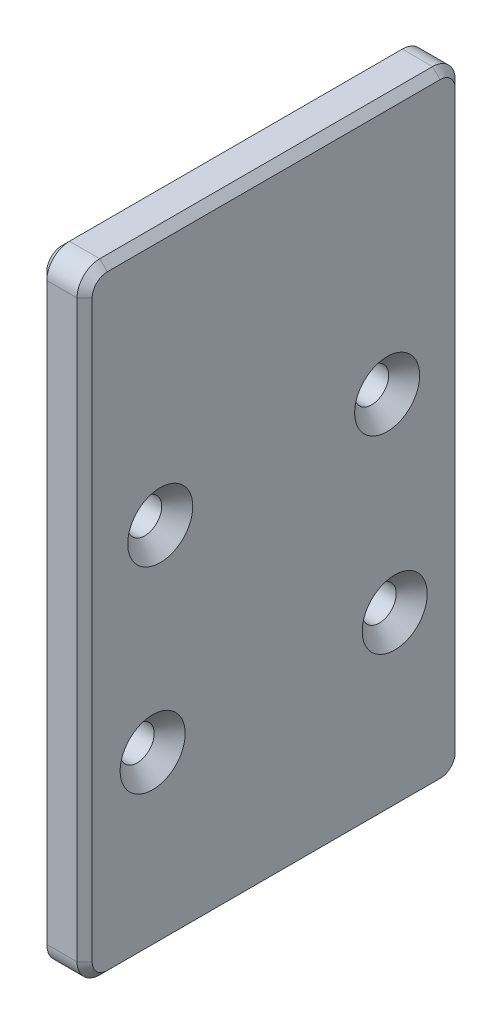
ISO-10303-21;
HEADER;
FILE_DESCRIPTION(('STEP AP214'),'2;1');
FILE_NAME('part.step','',(''),(''),'','','');
FILE_SCHEMA(('AUTOMOTIVE_DESIGN { 1 0 10303 214 1 1 1 1 }'));
ENDSEC;
DATA;
#1=APPLICATION_CONTEXT('core data for automotive mechanical design processes');
#2=APPLICATION_PROTOCOL_DEFINITION('international standard','automotive_design',2000,#1);
#3=PRODUCT_CONTEXT('',#1,'mechanical');
#4=PRODUCT('Part','Part','',(#3));
#5=PRODUCT_RELATED_PRODUCT_CATEGORY('part','',(#4));
#6=PRODUCT_DEFINITION_FORMATION('','',#4);
#7=PRODUCT_DEFINITION_CONTEXT('part definition',#1,'design');
#8=PRODUCT_DEFINITION('design','',#6,#7);
#9=PRODUCT_DEFINITION_SHAPE('','',#8);
#10=(LENGTH_UNIT() NAMED_UNIT(*) SI_UNIT(.MILLI.,.METRE.));
#11=(NAMED_UNIT(*) PLANE_ANGLE_UNIT() SI_UNIT($,.RADIAN.));
#12=(NAMED_UNIT(*) SI_UNIT($,.STERADIAN.) SOLID_ANGLE_UNIT());
#13=UNCERTAINTY_MEASURE_WITH_UNIT(LENGTH_MEASURE(1.E-05),#10,'distance_accuracy_value','');
#14=(GEOMETRIC_REPRESENTATION_CONTEXT(3) GLOBAL_UNCERTAINTY_ASSIGNED_CONTEXT((#13)) GLOBAL_UNIT_ASSIGNED_CONTEXT((#10,
#11,#12)) REPRESENTATION_CONTEXT('',''));
#15=CARTESIAN_POINT('',(0.,0.,0.));
#16=DIRECTION('',(0.,0.,1.));
#17=DIRECTION('',(1.,0.,0.));
#18=AXIS2_PLACEMENT_3D('',#15,#16,#17);
#19=CARTESIAN_POINT('',(6.,-41.,-25.));
#20=DIRECTION('',(0.,0.,1.));
#21=DIRECTION('',(1.,0.,0.));
#22=AXIS2_PLACEMENT_3D('',#19,#20,#21);
#23=PLANE('',#22);
#24=DIRECTION('',(-1.,0.,0.));
#25=VECTOR('',#24,1.);
#26=CARTESIAN_POINT('',(6.,-38.,-25.));
#27=LINE('',#26,#25);
#28=CARTESIAN_POINT('',(5.,-38.,-25.));
#29=VERTEX_POINT('',#28);
#30=CARTESIAN_POINT('',(1.,-38.,-25.));
#31=VERTEX_POINT('',#30);
#32=EDGE_CURVE('E288',#29,#31,#27,.T.);
#33=ORIENTED_EDGE('',*,*,#32,.T.);
#34=DIRECTION('',(0.,1.,0.));
#35=VECTOR('',#34,1.);
#36=CARTESIAN_POINT('',(1.,38.,-25.));
#37=LINE('',#36,#35);
#38=CARTESIAN_POINT('',(1.,38.,-25.));
#39=VERTEX_POINT('',#38);
#40=EDGE_CURVE('E193',#31,#39,#37,.T.);
#41=ORIENTED_EDGE('',*,*,#40,.T.);
#42=DIRECTION('',(-1.,0.,0.));
#43=VECTOR('',#42,1.);
#44=CARTESIAN_POINT('',(6.,38.,-25.));
#45=LINE('',#44,#43);
#46=CARTESIAN_POINT('',(5.,38.,-25.));
#47=VERTEX_POINT('',#46);
#48=EDGE_CURVE('E305',#39,#47,#45,.F.);
#49=ORIENTED_EDGE('',*,*,#48,.T.);
#50=DIRECTION('',(0.,-1.,0.));
#51=VECTOR('',#50,1.);
#52=CARTESIAN_POINT('',(5.,-41.,-25.));
#53=LINE('',#52,#51);
#54=EDGE_CURVE('E191',#47,#29,#53,.T.);
#55=ORIENTED_EDGE('',*,*,#54,.T.);
#56=EDGE_LOOP('',(#33,#41,#49,#55));
#57=FACE_BOUND('',#56,.T.);
#58=ADVANCED_FACE('F43',(#57),#23,.F.);
#59=CARTESIAN_POINT('',(6.,41.,25.));
#60=DIRECTION('',(0.,-1.,0.));
#61=DIRECTION('',(0.,0.,-1.));
#62=AXIS2_PLACEMENT_3D('',#59,#60,#61);
#63=PLANE('',#62);
#64=DIRECTION('',(-1.,0.,0.));
#65=VECTOR('',#64,1.);
#66=CARTESIAN_POINT('',(6.,41.,-22.));
#67=LINE('',#66,#65);
#68=CARTESIAN_POINT('',(5.,41.,-22.));
#69=VERTEX_POINT('',#68);
#70=CARTESIAN_POINT('',(1.,41.,-22.));
#71=VERTEX_POINT('',#70);
#72=EDGE_CURVE('E309',#69,#71,#67,.T.);
#73=ORIENTED_EDGE('',*,*,#72,.T.);
#74=DIRECTION('',(0.,0.,1.));
#75=VECTOR('',#74,1.);
#76=CARTESIAN_POINT('',(1.,41.,22.));
#77=LINE('',#76,#75);
#78=CARTESIAN_POINT('',(1.,41.,22.));
#79=VERTEX_POINT('',#78);
#80=EDGE_CURVE('E201',#71,#79,#77,.T.);
#81=ORIENTED_EDGE('',*,*,#80,.T.);
#82=DIRECTION('',(-1.,0.,0.));
#83=VECTOR('',#82,1.);
#84=CARTESIAN_POINT('',(6.,41.,22.));
#85=LINE('',#84,#83);
#86=CARTESIAN_POINT('',(5.,41.,22.));
#87=VERTEX_POINT('',#86);
#88=EDGE_CURVE('E177',#79,#87,#85,.F.);
#89=ORIENTED_EDGE('',*,*,#88,.T.);
#90=DIRECTION('',(0.,0.,-1.));
#91=VECTOR('',#90,1.);
#92=CARTESIAN_POINT('',(5.,41.,25.));
#93=LINE('',#92,#91);
#94=EDGE_CURVE('E199',#87,#69,#93,.T.);
#95=ORIENTED_EDGE('',*,*,#94,.T.);
#96=EDGE_LOOP('',(#73,#81,#89,#95));
#97=FACE_BOUND('',#96,.T.);
#98=ADVANCED_FACE('F375',(#97),#63,.F.);
#99=CARTESIAN_POINT('',(6.,-41.,25.));
#100=DIRECTION('',(0.,0.,-1.));
#101=DIRECTION('',(-1.,0.,0.));
#102=AXIS2_PLACEMENT_3D('',#99,#100,#101);
#103=PLANE('',#102);
#104=DIRECTION('',(-1.,0.,0.));
#105=VECTOR('',#104,1.);
#106=CARTESIAN_POINT('',(6.,38.,25.));
#107=LINE('',#106,#105);
#108=CARTESIAN_POINT('',(5.,38.,25.));
#109=VERTEX_POINT('',#108);
#110=CARTESIAN_POINT('',(1.,38.,25.));
#111=VERTEX_POINT('',#110);
#112=EDGE_CURVE('E295',#109,#111,#107,.T.);
#113=ORIENTED_EDGE('',*,*,#112,.T.);
#114=DIRECTION('',(0.,-1.,0.));
#115=VECTOR('',#114,1.);
#116=CARTESIAN_POINT('',(1.,-38.,25.));
#117=LINE('',#116,#115);
#118=CARTESIAN_POINT('',(1.,-38.,25.));
#119=VERTEX_POINT('',#118);
#120=EDGE_CURVE('E210',#111,#119,#117,.T.);
#121=ORIENTED_EDGE('',*,*,#120,.T.);
#122=DIRECTION('',(-1.,0.,0.));
#123=VECTOR('',#122,1.);
#124=CARTESIAN_POINT('',(6.,-38.,25.));
#125=LINE('',#124,#123);
#126=CARTESIAN_POINT('',(5.,-38.,25.));
#127=VERTEX_POINT('',#126);
#128=EDGE_CURVE('E302',#119,#127,#125,.F.);
#129=ORIENTED_EDGE('',*,*,#128,.T.);
#130=DIRECTION('',(0.,1.,0.));
#131=VECTOR('',#130,1.);
#132=CARTESIAN_POINT('',(5.,-41.,25.));
#133=LINE('',#132,#131);
#134=EDGE_CURVE('E208',#127,#109,#133,.T.);
#135=ORIENTED_EDGE('',*,*,#134,.T.);
#136=EDGE_LOOP('',(#113,#121,#129,#135));
#137=FACE_BOUND('',#136,.T.);
#138=ADVANCED_FACE('F359',(#137),#103,.F.);
#139=CARTESIAN_POINT('',(6.,-41.,25.));
#140=DIRECTION('',(0.,1.,0.));
#141=DIRECTION('',(0.,0.,1.));
#142=AXIS2_PLACEMENT_3D('',#139,#140,#141);
#143=PLANE('',#142);
#144=DIRECTION('',(-1.,0.,0.));
#145=VECTOR('',#144,1.);
#146=CARTESIAN_POINT('',(6.,-41.,22.));
#147=LINE('',#146,#145);
#148=CARTESIAN_POINT('',(5.,-41.,22.));
#149=VERTEX_POINT('',#148);
#150=CARTESIAN_POINT('',(1.,-41.,22.));
#151=VERTEX_POINT('',#150);
#152=EDGE_CURVE('E293',#149,#151,#147,.T.);
#153=ORIENTED_EDGE('',*,*,#152,.T.);
#154=DIRECTION('',(0.,0.,-1.));
#155=VECTOR('',#154,1.);
#156=CARTESIAN_POINT('',(1.,-41.,-22.));
#157=LINE('',#156,#155);
#158=CARTESIAN_POINT('',(1.,-41.,-22.));
#159=VERTEX_POINT('',#158);
#160=EDGE_CURVE('E218',#151,#159,#157,.T.);
#161=ORIENTED_EDGE('',*,*,#160,.T.);
#162=DIRECTION('',(-1.,0.,0.));
#163=VECTOR('',#162,1.);
#164=CARTESIAN_POINT('',(6.,-41.,-22.));
#165=LINE('',#164,#163);
#166=CARTESIAN_POINT('',(5.,-41.,-22.));
#167=VERTEX_POINT('',#166);
#168=EDGE_CURVE('E249',#159,#167,#165,.F.);
#169=ORIENTED_EDGE('',*,*,#168,.T.);
#170=DIRECTION('',(0.,0.,1.));
#171=VECTOR('',#170,1.);
#172=CARTESIAN_POINT('',(5.,-41.,25.));
#173=LINE('',#172,#171);
#174=EDGE_CURVE('E216',#167,#149,#173,.T.);
#175=ORIENTED_EDGE('',*,*,#174,.T.);
#176=EDGE_LOOP('',(#153,#161,#169,#175));
#177=FACE_BOUND('',#176,.T.);
#178=ADVANCED_FACE('F291',(#177),#143,.F.);
#179=CARTESIAN_POINT('',(6.,0.,0.));
#180=DIRECTION('',(-1.,0.,0.));
#181=DIRECTION('',(0.,0.,1.));
#182=AXIS2_PLACEMENT_3D('',#179,#180,#181);
#183=PLANE('',#182);
#184=CARTESIAN_POINT('',(6.,7.50000000000023,-14.9999999999996));
#185=DIRECTION('',(1.,0.,0.));
#186=DIRECTION('',(0.,0.,-1.));
#187=AXIS2_PLACEMENT_3D('',#184,#185,#186);
#188=CIRCLE('',#187,4.3);
#189=CARTESIAN_POINT('',(6.,7.50000000000023,-19.2999999999995));
#190=VERTEX_POINT('',#189);
#191=EDGE_CURVE('E722',#190,#190,#188,.T.);
#192=ORIENTED_EDGE('',*,*,#191,.F.);
#193=EDGE_LOOP('',(#192));
#194=FACE_BOUND('',#193,.T.);
#195=CARTESIAN_POINT('',(6.,7.50000000000021,15.0000000000004));
#196=DIRECTION('',(1.,0.,0.));
#197=DIRECTION('',(0.,0.,-1.));
#198=AXIS2_PLACEMENT_3D('',#195,#196,#197);
#199=CIRCLE('',#198,4.3);
#200=CARTESIAN_POINT('',(6.,7.50000000000021,10.7000000000004));
#201=VERTEX_POINT('',#200);
#202=EDGE_CURVE('E729',#201,#201,#199,.T.);
#203=ORIENTED_EDGE('',*,*,#202,.F.);
#204=EDGE_LOOP('',(#203));
#205=FACE_BOUND('',#204,.T.);
#206=CARTESIAN_POINT('',(6.,-17.9999999999998,-15.9999999999996));
#207=DIRECTION('',(1.,0.,0.));
#208=DIRECTION('',(0.,0.,-1.));
#209=AXIS2_PLACEMENT_3D('',#206,#207,#208);
#210=CIRCLE('',#209,4.3);
#211=CARTESIAN_POINT('',(6.,-17.9999999999998,-20.2999999999996));
#212=VERTEX_POINT('',#211);
#213=EDGE_CURVE('E738',#212,#212,#210,.T.);
#214=ORIENTED_EDGE('',*,*,#213,.F.);
#215=EDGE_LOOP('',(#214));
#216=FACE_BOUND('',#215,.T.);
#217=CARTESIAN_POINT('',(6.,-17.9999999999998,16.0000000000004));
#218=DIRECTION('',(1.,0.,0.));
#219=DIRECTION('',(0.,0.,-1.));
#220=AXIS2_PLACEMENT_3D('',#217,#218,#219);
#221=CIRCLE('',#220,4.3);
#222=CARTESIAN_POINT('',(6.,-17.9999999999998,11.7000000000004));
#223=VERTEX_POINT('',#222);
#224=EDGE_CURVE('E747',#223,#223,#221,.T.);
#225=ORIENTED_EDGE('',*,*,#224,.F.);
#226=EDGE_LOOP('',(#225));
#227=FACE_BOUND('',#226,.T.);
#228=DIRECTION('',(0.,0.,1.));
#229=VECTOR('',#228,1.);
#230=CARTESIAN_POINT('',(6.,40.,0.));
#231=LINE('',#230,#229);
#232=CARTESIAN_POINT('',(6.,40.,-22.));
#233=VERTEX_POINT('',#232);
#234=CARTESIAN_POINT('',(6.,40.,22.));
#235=VERTEX_POINT('',#234);
#236=EDGE_CURVE('E53',#233,#235,#231,.T.);
#237=ORIENTED_EDGE('',*,*,#236,.T.);
#238=CARTESIAN_POINT('',(6.,38.,22.));
#239=DIRECTION('',(-1.,0.,0.));
#240=DIRECTION('',(0.,0.,1.));
#241=AXIS2_PLACEMENT_3D('',#238,#239,#240);
#242=CIRCLE('',#241,2.);
#243=CARTESIAN_POINT('',(6.,38.,24.));
#244=VERTEX_POINT('',#243);
#245=EDGE_CURVE('E11',#235,#244,#242,.F.);
#246=ORIENTED_EDGE('',*,*,#245,.T.);
#247=DIRECTION('',(0.,-1.,0.));
#248=VECTOR('',#247,1.);
#249=CARTESIAN_POINT('',(6.,0.,24.));
#250=LINE('',#249,#248);
#251=CARTESIAN_POINT('',(6.,-38.,24.));
#252=VERTEX_POINT('',#251);
#253=EDGE_CURVE('E220',#244,#252,#250,.T.);
#254=ORIENTED_EDGE('',*,*,#253,.T.);
#255=CARTESIAN_POINT('',(6.,-38.,22.));
#256=DIRECTION('',(-1.,0.,0.));
#257=DIRECTION('',(0.,0.,1.));
#258=AXIS2_PLACEMENT_3D('',#255,#256,#257);
#259=CIRCLE('',#258,2.);
#260=CARTESIAN_POINT('',(6.,-40.,22.));
#261=VERTEX_POINT('',#260);
#262=EDGE_CURVE('E222',#252,#261,#259,.F.);
#263=ORIENTED_EDGE('',*,*,#262,.T.);
#264=DIRECTION('',(0.,0.,-1.));
#265=VECTOR('',#264,1.);
#266=CARTESIAN_POINT('',(6.,-40.,0.));
#267=LINE('',#266,#265);
#268=CARTESIAN_POINT('',(6.,-40.,-22.));
#269=VERTEX_POINT('',#268);
#270=EDGE_CURVE('E224',#261,#269,#267,.T.);
#271=ORIENTED_EDGE('',*,*,#270,.T.);
#272=CARTESIAN_POINT('',(6.,-38.,-22.));
#273=DIRECTION('',(-1.,0.,0.));
#274=DIRECTION('',(0.,0.,1.));
#275=AXIS2_PLACEMENT_3D('',#272,#273,#274);
#276=CIRCLE('',#275,2.);
#277=CARTESIAN_POINT('',(6.,-38.,-24.));
#278=VERTEX_POINT('',#277);
#279=EDGE_CURVE('E226',#269,#278,#276,.F.);
#280=ORIENTED_EDGE('',*,*,#279,.T.);
#281=DIRECTION('',(0.,1.,0.));
#282=VECTOR('',#281,1.);
#283=CARTESIAN_POINT('',(6.,0.,-24.));
#284=LINE('',#283,#282);
#285=CARTESIAN_POINT('',(6.,38.,-24.));
#286=VERTEX_POINT('',#285);
#287=EDGE_CURVE('E228',#278,#286,#284,.T.);
#288=ORIENTED_EDGE('',*,*,#287,.T.);
#289=CARTESIAN_POINT('',(6.,38.,-22.));
#290=DIRECTION('',(-1.,0.,0.));
#291=DIRECTION('',(0.,0.,1.));
#292=AXIS2_PLACEMENT_3D('',#289,#290,#291);
#293=CIRCLE('',#292,2.);
#294=EDGE_CURVE('E64',#286,#233,#293,.F.);
#295=ORIENTED_EDGE('',*,*,#294,.T.);
#296=EDGE_LOOP('',(#237,#246,#254,#263,#271,#280,#288,#295));
#297=FACE_BOUND('',#296,.T.);
#298=ADVANCED_FACE('F347',(#194,#205,#216,#227,#297),#183,.F.);
#299=CARTESIAN_POINT('',(0.,0.,0.));
#300=DIRECTION('',(-1.,0.,0.));
#301=DIRECTION('',(0.,0.,1.));
#302=AXIS2_PLACEMENT_3D('',#299,#300,#301);
#303=PLANE('',#302);
#304=CARTESIAN_POINT('',(0.,7.50000000000023,-14.9999999999996));
#305=DIRECTION('',(1.,0.,0.));
#306=DIRECTION('',(0.,0.,-1.));
#307=AXIS2_PLACEMENT_3D('',#304,#305,#306);
#308=CIRCLE('',#307,2.25);
#309=CARTESIAN_POINT('',(0.,7.50000000000023,-17.2499999999995));
#310=VERTEX_POINT('',#309);
#311=EDGE_CURVE('E724',#310,#310,#308,.T.);
#312=ORIENTED_EDGE('',*,*,#311,.T.);
#313=EDGE_LOOP('',(#312));
#314=FACE_BOUND('',#313,.T.);
#315=CARTESIAN_POINT('',(0.,7.50000000000021,15.0000000000004));
#316=DIRECTION('',(1.,0.,0.));
#317=DIRECTION('',(0.,0.,-1.));
#318=AXIS2_PLACEMENT_3D('',#315,#316,#317);
#319=CIRCLE('',#318,2.25);
#320=CARTESIAN_POINT('',(0.,7.50000000000021,12.7500000000005));
#321=VERTEX_POINT('',#320);
#322=EDGE_CURVE('E735',#321,#321,#319,.T.);
#323=ORIENTED_EDGE('',*,*,#322,.T.);
#324=EDGE_LOOP('',(#323));
#325=FACE_BOUND('',#324,.T.);
#326=CARTESIAN_POINT('',(0.,-17.9999999999998,-15.9999999999996));
#327=DIRECTION('',(1.,0.,0.));
#328=DIRECTION('',(0.,0.,-1.));
#329=AXIS2_PLACEMENT_3D('',#326,#327,#328);
#330=CIRCLE('',#329,2.25);
#331=CARTESIAN_POINT('',(0.,-17.9999999999998,-18.2499999999996));
#332=VERTEX_POINT('',#331);
#333=EDGE_CURVE('E744',#332,#332,#330,.T.);
#334=ORIENTED_EDGE('',*,*,#333,.T.);
#335=EDGE_LOOP('',(#334));
#336=FACE_BOUND('',#335,.T.);
#337=CARTESIAN_POINT('',(0.,-17.9999999999998,16.0000000000004));
#338=DIRECTION('',(1.,0.,0.));
#339=DIRECTION('',(0.,0.,-1.));
#340=AXIS2_PLACEMENT_3D('',#337,#338,#339);
#341=CIRCLE('',#340,2.25);
#342=CARTESIAN_POINT('',(0.,-17.9999999999998,13.7500000000004));
#343=VERTEX_POINT('',#342);
#344=EDGE_CURVE('E253',#343,#343,#341,.T.);
#345=ORIENTED_EDGE('',*,*,#344,.T.);
#346=EDGE_LOOP('',(#345));
#347=FACE_BOUND('',#346,.T.);
#348=DIRECTION('',(0.,-1.,0.));
#349=VECTOR('',#348,1.);
#350=CARTESIAN_POINT('',(0.,-38.,-24.));
#351=LINE('',#350,#349);
#352=CARTESIAN_POINT('',(0.,38.,-24.));
#353=VERTEX_POINT('',#352);
#354=CARTESIAN_POINT('',(0.,-38.,-24.));
#355=VERTEX_POINT('',#354);
#356=EDGE_CURVE('E181',#353,#355,#351,.T.);
#357=ORIENTED_EDGE('',*,*,#356,.T.);
#358=CARTESIAN_POINT('',(0.,-38.,-22.));
#359=DIRECTION('',(-1.,0.,0.));
#360=DIRECTION('',(0.,0.,1.));
#361=AXIS2_PLACEMENT_3D('',#358,#359,#360);
#362=CIRCLE('',#361,1.99999999999999);
#363=CARTESIAN_POINT('',(0.,-40.,-22.));
#364=VERTEX_POINT('',#363);
#365=EDGE_CURVE('E162',#355,#364,#362,.T.);
#366=ORIENTED_EDGE('',*,*,#365,.T.);
#367=DIRECTION('',(0.,0.,1.));
#368=VECTOR('',#367,1.);
#369=CARTESIAN_POINT('',(0.,-40.,22.));
#370=LINE('',#369,#368);
#371=CARTESIAN_POINT('',(0.,-40.,22.));
#372=VERTEX_POINT('',#371);
#373=EDGE_CURVE('E170',#364,#372,#370,.T.);
#374=ORIENTED_EDGE('',*,*,#373,.T.);
#375=CARTESIAN_POINT('',(0.,-38.,22.));
#376=DIRECTION('',(-1.,0.,0.));
#377=DIRECTION('',(0.,0.,1.));
#378=AXIS2_PLACEMENT_3D('',#375,#376,#377);
#379=CIRCLE('',#378,2.);
#380=CARTESIAN_POINT('',(0.,-38.,24.));
#381=VERTEX_POINT('',#380);
#382=EDGE_CURVE('E176',#372,#381,#379,.T.);
#383=ORIENTED_EDGE('',*,*,#382,.T.);
#384=DIRECTION('',(0.,1.,0.));
#385=VECTOR('',#384,1.);
#386=CARTESIAN_POINT('',(0.,38.,24.));
#387=LINE('',#386,#385);
#388=CARTESIAN_POINT('',(0.,38.,24.));
#389=VERTEX_POINT('',#388);
#390=EDGE_CURVE('E315',#381,#389,#387,.T.);
#391=ORIENTED_EDGE('',*,*,#390,.T.);
#392=CARTESIAN_POINT('',(0.,38.,22.));
#393=DIRECTION('',(-1.,0.,0.));
#394=DIRECTION('',(0.,0.,1.));
#395=AXIS2_PLACEMENT_3D('',#392,#393,#394);
#396=CIRCLE('',#395,1.99999999999999);
#397=CARTESIAN_POINT('',(0.,40.,22.));
#398=VERTEX_POINT('',#397);
#399=EDGE_CURVE('E317',#389,#398,#396,.T.);
#400=ORIENTED_EDGE('',*,*,#399,.T.);
#401=DIRECTION('',(0.,0.,-1.));
#402=VECTOR('',#401,1.);
#403=CARTESIAN_POINT('',(0.,40.,-22.));
#404=LINE('',#403,#402);
#405=CARTESIAN_POINT('',(0.,40.,-22.));
#406=VERTEX_POINT('',#405);
#407=EDGE_CURVE('E319',#398,#406,#404,.T.);
#408=ORIENTED_EDGE('',*,*,#407,.T.);
#409=CARTESIAN_POINT('',(0.,38.,-22.));
#410=DIRECTION('',(-1.,0.,0.));
#411=DIRECTION('',(0.,0.,1.));
#412=AXIS2_PLACEMENT_3D('',#409,#410,#411);
#413=CIRCLE('',#412,2.);
#414=EDGE_CURVE('E186',#406,#353,#413,.T.);
#415=ORIENTED_EDGE('',*,*,#414,.T.);
#416=EDGE_LOOP('',(#357,#366,#374,#383,#391,#400,#408,#415));
#417=FACE_BOUND('',#416,.T.);
#418=ADVANCED_FACE('F179',(#314,#325,#336,#347,#417),#303,.T.);
#419=CARTESIAN_POINT('',(6.,-38.,22.));
#420=DIRECTION('',(-1.,0.,0.));
#421=DIRECTION('',(0.,0.,1.));
#422=AXIS2_PLACEMENT_3D('',#419,#420,#421);
#423=CYLINDRICAL_SURFACE('',#422,3.);
#424=ORIENTED_EDGE('',*,*,#128,.F.);
#425=CARTESIAN_POINT('',(1.,-38.,22.));
#426=DIRECTION('',(-1.,0.,0.));
#427=DIRECTION('',(0.,0.,1.));
#428=AXIS2_PLACEMENT_3D('',#425,#426,#427);
#429=CIRCLE('',#428,3.);
#430=EDGE_CURVE('E214',#119,#151,#429,.F.);
#431=ORIENTED_EDGE('',*,*,#430,.T.);
#432=ORIENTED_EDGE('',*,*,#152,.F.);
#433=CARTESIAN_POINT('',(5.,-38.,22.));
#434=DIRECTION('',(-1.,0.,0.));
#435=DIRECTION('',(0.,0.,1.));
#436=AXIS2_PLACEMENT_3D('',#433,#434,#435);
#437=CIRCLE('',#436,3.);
#438=EDGE_CURVE('E212',#149,#127,#437,.T.);
#439=ORIENTED_EDGE('',*,*,#438,.T.);
#440=EDGE_LOOP('',(#424,#431,#432,#439));
#441=FACE_BOUND('',#440,.T.);
#442=ADVANCED_FACE('F386',(#441),#423,.T.);
#443=CARTESIAN_POINT('',(6.,-38.,-22.));
#444=DIRECTION('',(-1.,0.,0.));
#445=DIRECTION('',(0.,0.,1.));
#446=AXIS2_PLACEMENT_3D('',#443,#444,#445);
#447=CYLINDRICAL_SURFACE('',#446,3.);
#448=ORIENTED_EDGE('',*,*,#168,.F.);
#449=CARTESIAN_POINT('',(1.,-38.,-22.));
#450=DIRECTION('',(-1.,0.,0.));
#451=DIRECTION('',(0.,0.,1.));
#452=AXIS2_PLACEMENT_3D('',#449,#450,#451);
#453=CIRCLE('',#452,3.);
#454=EDGE_CURVE('E164',#159,#31,#453,.F.);
#455=ORIENTED_EDGE('',*,*,#454,.T.);
#456=ORIENTED_EDGE('',*,*,#32,.F.);
#457=CARTESIAN_POINT('',(5.,-38.,-22.));
#458=DIRECTION('',(-1.,0.,0.));
#459=DIRECTION('',(0.,0.,1.));
#460=AXIS2_PLACEMENT_3D('',#457,#458,#459);
#461=CIRCLE('',#460,3.);
#462=EDGE_CURVE('E183',#29,#167,#461,.T.);
#463=ORIENTED_EDGE('',*,*,#462,.T.);
#464=EDGE_LOOP('',(#448,#455,#456,#463));
#465=FACE_BOUND('',#464,.T.);
#466=ADVANCED_FACE('F286',(#465),#447,.T.);
#467=CARTESIAN_POINT('',(6.,38.,22.));
#468=DIRECTION('',(-1.,0.,0.));
#469=DIRECTION('',(0.,0.,1.));
#470=AXIS2_PLACEMENT_3D('',#467,#468,#469);
#471=CYLINDRICAL_SURFACE('',#470,3.);
#472=ORIENTED_EDGE('',*,*,#88,.F.);
#473=CARTESIAN_POINT('',(1.,38.,22.));
#474=DIRECTION('',(-1.,0.,0.));
#475=DIRECTION('',(0.,0.,1.));
#476=AXIS2_PLACEMENT_3D('',#473,#474,#475);
#477=CIRCLE('',#476,3.);
#478=EDGE_CURVE('E206',#79,#111,#477,.F.);
#479=ORIENTED_EDGE('',*,*,#478,.T.);
#480=ORIENTED_EDGE('',*,*,#112,.F.);
#481=CARTESIAN_POINT('',(5.,38.,22.));
#482=DIRECTION('',(-1.,0.,0.));
#483=DIRECTION('',(0.,0.,1.));
#484=AXIS2_PLACEMENT_3D('',#481,#482,#483);
#485=CIRCLE('',#484,3.);
#486=EDGE_CURVE('E203',#109,#87,#485,.T.);
#487=ORIENTED_EDGE('',*,*,#486,.T.);
#488=EDGE_LOOP('',(#472,#479,#480,#487));
#489=FACE_BOUND('',#488,.T.);
#490=ADVANCED_FACE('F364',(#489),#471,.T.);
#491=CARTESIAN_POINT('',(6.,38.,-22.));
#492=DIRECTION('',(-1.,0.,0.));
#493=DIRECTION('',(0.,0.,1.));
#494=AXIS2_PLACEMENT_3D('',#491,#492,#493);
#495=CYLINDRICAL_SURFACE('',#494,3.);
#496=ORIENTED_EDGE('',*,*,#48,.F.);
#497=CARTESIAN_POINT('',(1.,38.,-22.));
#498=DIRECTION('',(-1.,0.,0.));
#499=DIRECTION('',(0.,0.,1.));
#500=AXIS2_PLACEMENT_3D('',#497,#498,#499);
#501=CIRCLE('',#500,3.);
#502=EDGE_CURVE('E197',#39,#71,#501,.F.);
#503=ORIENTED_EDGE('',*,*,#502,.T.);
#504=ORIENTED_EDGE('',*,*,#72,.F.);
#505=CARTESIAN_POINT('',(5.,38.,-22.));
#506=DIRECTION('',(-1.,0.,0.));
#507=DIRECTION('',(0.,0.,1.));
#508=AXIS2_PLACEMENT_3D('',#505,#506,#507);
#509=CIRCLE('',#508,3.);
#510=EDGE_CURVE('E195',#69,#47,#509,.T.);
#511=ORIENTED_EDGE('',*,*,#510,.T.);
#512=EDGE_LOOP('',(#496,#503,#504,#511));
#513=FACE_BOUND('',#512,.T.);
#514=ADVANCED_FACE('F333',(#513),#495,.T.);
#515=CARTESIAN_POINT('',(0.,38.,22.));
#516=DIRECTION('',(1.,0.,0.));
#517=DIRECTION('',(0.,0.,-1.));
#518=AXIS2_PLACEMENT_3D('',#515,#516,#517);
#519=CONICAL_SURFACE('',#518,2.,0.785398163397449);
#520=DIRECTION('',(-0.707106781186546,0.,-0.707106781186549));
#521=VECTOR('',#520,1.);
#522=CARTESIAN_POINT('',(1.,38.,25.));
#523=LINE('',#522,#521);
#524=EDGE_CURVE('E243',#111,#389,#523,.T.);
#525=ORIENTED_EDGE('',*,*,#524,.F.);
#526=ORIENTED_EDGE('',*,*,#478,.F.);
#527=DIRECTION('',(0.707106781186545,0.70710678118655,0.));
#528=VECTOR('',#527,1.);
#529=CARTESIAN_POINT('',(0.,40.,22.));
#530=LINE('',#529,#528);
#531=EDGE_CURVE('E246',#398,#79,#530,.T.);
#532=ORIENTED_EDGE('',*,*,#531,.F.);
#533=ORIENTED_EDGE('',*,*,#399,.F.);
#534=EDGE_LOOP('',(#525,#526,#532,#533));
#535=FACE_BOUND('',#534,.T.);
#536=ADVANCED_FACE('F368',(#535),#519,.T.);
#537=CARTESIAN_POINT('',(1.,41.,25.));
#538=DIRECTION('',(-0.707106781186547,0.707106781186547,0.));
#539=DIRECTION('',(0.,0.,-1.));
#540=AXIS2_PLACEMENT_3D('',#537,#538,#539);
#541=PLANE('',#540);
#542=ORIENTED_EDGE('',*,*,#531,.T.);
#543=ORIENTED_EDGE('',*,*,#80,.F.);
#544=DIRECTION('',(0.707106781186547,0.707106781186547,0.));
#545=VECTOR('',#544,1.);
#546=CARTESIAN_POINT('',(0.,40.,-22.));
#547=LINE('',#546,#545);
#548=EDGE_CURVE('E240',#406,#71,#547,.T.);
#549=ORIENTED_EDGE('',*,*,#548,.F.);
#550=ORIENTED_EDGE('',*,*,#407,.F.);
#551=EDGE_LOOP('',(#542,#543,#549,#550));
#552=FACE_BOUND('',#551,.T.);
#553=ADVANCED_FACE('F373',(#552),#541,.T.);
#554=CARTESIAN_POINT('',(1.,-41.,25.));
#555=DIRECTION('',(-0.707106781186547,0.,0.707106781186547));
#556=DIRECTION('',(0.,1.,0.));
#557=AXIS2_PLACEMENT_3D('',#554,#555,#556);
#558=PLANE('',#557);
#559=ORIENTED_EDGE('',*,*,#524,.T.);
#560=ORIENTED_EDGE('',*,*,#390,.F.);
#561=DIRECTION('',(-0.707106781186547,0.,-0.707106781186547));
#562=VECTOR('',#561,1.);
#563=CARTESIAN_POINT('',(1.,-38.,25.));
#564=LINE('',#563,#562);
#565=EDGE_CURVE('E237',#119,#381,#564,.T.);
#566=ORIENTED_EDGE('',*,*,#565,.F.);
#567=ORIENTED_EDGE('',*,*,#120,.F.);
#568=EDGE_LOOP('',(#559,#560,#566,#567));
#569=FACE_BOUND('',#568,.T.);
#570=ADVANCED_FACE('F424',(#569),#558,.T.);
#571=CARTESIAN_POINT('',(0.,38.,-22.));
#572=DIRECTION('',(1.,0.,0.));
#573=DIRECTION('',(0.,0.,-1.));
#574=AXIS2_PLACEMENT_3D('',#571,#572,#573);
#575=CONICAL_SURFACE('',#574,2.,0.785398163397447);
#576=ORIENTED_EDGE('',*,*,#548,.T.);
#577=ORIENTED_EDGE('',*,*,#502,.F.);
#578=DIRECTION('',(0.707106781186549,0.,-0.707106781186546));
#579=VECTOR('',#578,1.);
#580=CARTESIAN_POINT('',(0.,38.,-24.));
#581=LINE('',#580,#579);
#582=EDGE_CURVE('E234',#353,#39,#581,.T.);
#583=ORIENTED_EDGE('',*,*,#582,.F.);
#584=ORIENTED_EDGE('',*,*,#414,.F.);
#585=EDGE_LOOP('',(#576,#577,#583,#584));
#586=FACE_BOUND('',#585,.T.);
#587=ADVANCED_FACE('F326',(#586),#575,.T.);
#588=CARTESIAN_POINT('',(0.,-38.,22.));
#589=DIRECTION('',(1.,0.,0.));
#590=DIRECTION('',(0.,0.,-1.));
#591=AXIS2_PLACEMENT_3D('',#588,#589,#590);
#592=CONICAL_SURFACE('',#591,2.,0.785398163397447);
#593=ORIENTED_EDGE('',*,*,#565,.T.);
#594=ORIENTED_EDGE('',*,*,#382,.F.);
#595=DIRECTION('',(-0.707106781186547,0.707106781186547,0.));
#596=VECTOR('',#595,1.);
#597=CARTESIAN_POINT('',(1.,-41.,22.));
#598=LINE('',#597,#596);
#599=EDGE_CURVE('E173',#151,#372,#598,.T.);
#600=ORIENTED_EDGE('',*,*,#599,.F.);
#601=ORIENTED_EDGE('',*,*,#430,.F.);
#602=EDGE_LOOP('',(#593,#594,#600,#601));
#603=FACE_BOUND('',#602,.T.);
#604=ADVANCED_FACE('F412',(#603),#592,.T.);
#605=CARTESIAN_POINT('',(1.,-41.,-25.));
#606=DIRECTION('',(-0.707106781186547,0.,-0.707106781186547));
#607=DIRECTION('',(0.,-1.,0.));
#608=AXIS2_PLACEMENT_3D('',#605,#606,#607);
#609=PLANE('',#608);
#610=ORIENTED_EDGE('',*,*,#582,.T.);
#611=ORIENTED_EDGE('',*,*,#40,.F.);
#612=DIRECTION('',(0.707106781186547,0.,-0.707106781186547));
#613=VECTOR('',#612,1.);
#614=CARTESIAN_POINT('',(0.,-38.,-24.));
#615=LINE('',#614,#613);
#616=EDGE_CURVE('E167',#355,#31,#615,.T.);
#617=ORIENTED_EDGE('',*,*,#616,.F.);
#618=ORIENTED_EDGE('',*,*,#356,.F.);
#619=EDGE_LOOP('',(#610,#611,#617,#618));
#620=FACE_BOUND('',#619,.T.);
#621=ADVANCED_FACE('F329',(#620),#609,.T.);
#622=CARTESIAN_POINT('',(1.,-41.,25.));
#623=DIRECTION('',(-0.707106781186547,-0.707106781186547,0.));
#624=DIRECTION('',(0.,0.,1.));
#625=AXIS2_PLACEMENT_3D('',#622,#623,#624);
#626=PLANE('',#625);
#627=ORIENTED_EDGE('',*,*,#599,.T.);
#628=ORIENTED_EDGE('',*,*,#373,.F.);
#629=DIRECTION('',(-0.707106781186547,0.707106781186547,0.));
#630=VECTOR('',#629,1.);
#631=CARTESIAN_POINT('',(1.,-41.,-22.));
#632=LINE('',#631,#630);
#633=EDGE_CURVE('E158',#159,#364,#632,.T.);
#634=ORIENTED_EDGE('',*,*,#633,.F.);
#635=ORIENTED_EDGE('',*,*,#160,.F.);
#636=EDGE_LOOP('',(#627,#628,#634,#635));
#637=FACE_BOUND('',#636,.T.);
#638=ADVANCED_FACE('F171',(#637),#626,.T.);
#639=CARTESIAN_POINT('',(0.,-38.,-22.));
#640=DIRECTION('',(1.,0.,0.));
#641=DIRECTION('',(0.,0.,-1.));
#642=AXIS2_PLACEMENT_3D('',#639,#640,#641);
#643=CONICAL_SURFACE('',#642,2.,0.785398163397449);
#644=ORIENTED_EDGE('',*,*,#616,.T.);
#645=ORIENTED_EDGE('',*,*,#454,.F.);
#646=ORIENTED_EDGE('',*,*,#633,.T.);
#647=ORIENTED_EDGE('',*,*,#365,.F.);
#648=EDGE_LOOP('',(#644,#645,#646,#647));
#649=FACE_BOUND('',#648,.T.);
#650=ADVANCED_FACE('F160',(#649),#643,.T.);
#651=CARTESIAN_POINT('',(6.,-38.,-22.));
#652=DIRECTION('',(-1.,0.,0.));
#653=DIRECTION('',(0.,0.,1.));
#654=AXIS2_PLACEMENT_3D('',#651,#652,#653);
#655=CONICAL_SURFACE('',#654,2.,0.785398163397449);
#656=DIRECTION('',(0.707106781186547,0.707106781186547,0.));
#657=VECTOR('',#656,1.);
#658=CARTESIAN_POINT('',(5.,-41.,-22.));
#659=LINE('',#658,#657);
#660=EDGE_CURVE('E266',#167,#269,#659,.T.);
#661=ORIENTED_EDGE('',*,*,#660,.F.);
#662=ORIENTED_EDGE('',*,*,#462,.F.);
#663=DIRECTION('',(-0.707106781186547,0.,-0.707106781186547));
#664=VECTOR('',#663,1.);
#665=CARTESIAN_POINT('',(6.,-38.,-24.));
#666=LINE('',#665,#664);
#667=EDGE_CURVE('E48',#278,#29,#666,.T.);
#668=ORIENTED_EDGE('',*,*,#667,.F.);
#669=ORIENTED_EDGE('',*,*,#279,.F.);
#670=EDGE_LOOP('',(#661,#662,#668,#669));
#671=FACE_BOUND('',#670,.T.);
#672=ADVANCED_FACE('F46',(#671),#655,.T.);
#673=CARTESIAN_POINT('',(6.,0.,-24.));
#674=DIRECTION('',(-0.707106781186547,0.,0.707106781186547));
#675=DIRECTION('',(0.,1.,0.));
#676=AXIS2_PLACEMENT_3D('',#673,#674,#675);
#677=PLANE('',#676);
#678=ORIENTED_EDGE('',*,*,#667,.T.);
#679=ORIENTED_EDGE('',*,*,#54,.F.);
#680=DIRECTION('',(-0.707106781186547,0.,-0.707106781186547));
#681=VECTOR('',#680,1.);
#682=CARTESIAN_POINT('',(6.,38.,-24.));
#683=LINE('',#682,#681);
#684=EDGE_CURVE('E264',#286,#47,#683,.T.);
#685=ORIENTED_EDGE('',*,*,#684,.F.);
#686=ORIENTED_EDGE('',*,*,#287,.F.);
#687=EDGE_LOOP('',(#678,#679,#685,#686));
#688=FACE_BOUND('',#687,.T.);
#689=ADVANCED_FACE('F277',(#688),#677,.F.);
#690=CARTESIAN_POINT('',(6.,-40.,0.));
#691=DIRECTION('',(-0.707106781186547,0.707106781186547,0.));
#692=DIRECTION('',(0.,0.,-1.));
#693=AXIS2_PLACEMENT_3D('',#690,#691,#692);
#694=PLANE('',#693);
#695=ORIENTED_EDGE('',*,*,#660,.T.);
#696=ORIENTED_EDGE('',*,*,#270,.F.);
#697=DIRECTION('',(0.707106781186547,0.707106781186547,0.));
#698=VECTOR('',#697,1.);
#699=CARTESIAN_POINT('',(5.,-41.,22.));
#700=LINE('',#699,#698);
#701=EDGE_CURVE('E261',#149,#261,#700,.T.);
#702=ORIENTED_EDGE('',*,*,#701,.F.);
#703=ORIENTED_EDGE('',*,*,#174,.F.);
#704=EDGE_LOOP('',(#695,#696,#702,#703));
#705=FACE_BOUND('',#704,.T.);
#706=ADVANCED_FACE('F467',(#705),#694,.F.);
#707=CARTESIAN_POINT('',(6.,38.,-22.));
#708=DIRECTION('',(-1.,0.,0.));
#709=DIRECTION('',(0.,0.,1.));
#710=AXIS2_PLACEMENT_3D('',#707,#708,#709);
#711=CONICAL_SURFACE('',#710,2.,0.785398163397447);
#712=ORIENTED_EDGE('',*,*,#684,.T.);
#713=ORIENTED_EDGE('',*,*,#510,.F.);
#714=DIRECTION('',(-0.707106781186547,0.707106781186547,0.));
#715=VECTOR('',#714,1.);
#716=CARTESIAN_POINT('',(6.,40.,-22.));
#717=LINE('',#716,#715);
#718=EDGE_CURVE('E258',#233,#69,#717,.T.);
#719=ORIENTED_EDGE('',*,*,#718,.F.);
#720=ORIENTED_EDGE('',*,*,#294,.F.);
#721=EDGE_LOOP('',(#712,#713,#719,#720));
#722=FACE_BOUND('',#721,.T.);
#723=ADVANCED_FACE('F337',(#722),#711,.T.);
#724=CARTESIAN_POINT('',(6.,-38.,22.));
#725=DIRECTION('',(-1.,0.,0.));
#726=DIRECTION('',(0.,0.,1.));
#727=AXIS2_PLACEMENT_3D('',#724,#725,#726);
#728=CONICAL_SURFACE('',#727,2.,0.785398163397447);
#729=ORIENTED_EDGE('',*,*,#701,.T.);
#730=ORIENTED_EDGE('',*,*,#262,.F.);
#731=DIRECTION('',(0.707106781186549,0.,-0.707106781186546));
#732=VECTOR('',#731,1.);
#733=CARTESIAN_POINT('',(5.,-38.,25.));
#734=LINE('',#733,#732);
#735=EDGE_CURVE('E255',#127,#252,#734,.T.);
#736=ORIENTED_EDGE('',*,*,#735,.F.);
#737=ORIENTED_EDGE('',*,*,#438,.F.);
#738=EDGE_LOOP('',(#729,#730,#736,#737));
#739=FACE_BOUND('',#738,.T.);
#740=ADVANCED_FACE('F352',(#739),#728,.T.);
#741=CARTESIAN_POINT('',(6.,40.,0.));
#742=DIRECTION('',(-0.707106781186547,-0.707106781186547,0.));
#743=DIRECTION('',(0.,0.,1.));
#744=AXIS2_PLACEMENT_3D('',#741,#742,#743);
#745=PLANE('',#744);
#746=ORIENTED_EDGE('',*,*,#718,.T.);
#747=ORIENTED_EDGE('',*,*,#94,.F.);
#748=DIRECTION('',(-0.707106781186547,0.707106781186547,0.));
#749=VECTOR('',#748,1.);
#750=CARTESIAN_POINT('',(6.,40.,22.));
#751=LINE('',#750,#749);
#752=EDGE_CURVE('E252',#235,#87,#751,.T.);
#753=ORIENTED_EDGE('',*,*,#752,.F.);
#754=ORIENTED_EDGE('',*,*,#236,.F.);
#755=EDGE_LOOP('',(#746,#747,#753,#754));
#756=FACE_BOUND('',#755,.T.);
#757=ADVANCED_FACE('F340',(#756),#745,.F.);
#758=CARTESIAN_POINT('',(6.,0.,24.));
#759=DIRECTION('',(-0.707106781186547,0.,-0.707106781186547));
#760=DIRECTION('',(0.,-1.,0.));
#761=AXIS2_PLACEMENT_3D('',#758,#759,#760);
#762=PLANE('',#761);
#763=ORIENTED_EDGE('',*,*,#735,.T.);
#764=ORIENTED_EDGE('',*,*,#253,.F.);
#765=DIRECTION('',(0.707106781186547,0.,-0.707106781186547));
#766=VECTOR('',#765,1.);
#767=CARTESIAN_POINT('',(5.,38.,25.));
#768=LINE('',#767,#766);
#769=EDGE_CURVE('E250',#109,#244,#768,.T.);
#770=ORIENTED_EDGE('',*,*,#769,.F.);
#771=ORIENTED_EDGE('',*,*,#134,.F.);
#772=EDGE_LOOP('',(#763,#764,#770,#771));
#773=FACE_BOUND('',#772,.T.);
#774=ADVANCED_FACE('F356',(#773),#762,.F.);
#775=CARTESIAN_POINT('',(6.,38.,22.));
#776=DIRECTION('',(-1.,0.,0.));
#777=DIRECTION('',(0.,0.,1.));
#778=AXIS2_PLACEMENT_3D('',#775,#776,#777);
#779=CONICAL_SURFACE('',#778,2.,0.785398163397449);
#780=ORIENTED_EDGE('',*,*,#752,.T.);
#781=ORIENTED_EDGE('',*,*,#486,.F.);
#782=ORIENTED_EDGE('',*,*,#769,.T.);
#783=ORIENTED_EDGE('',*,*,#245,.F.);
#784=EDGE_LOOP('',(#780,#781,#782,#783));
#785=FACE_BOUND('',#784,.T.);
#786=ADVANCED_FACE('F344',(#785),#779,.T.);
#787=CARTESIAN_POINT('',(6.,-17.9999999999998,16.0000000000004));
#788=DIRECTION('',(1.,0.,0.));
#789=DIRECTION('',(0.,0.,-1.));
#790=AXIS2_PLACEMENT_3D('',#787,#788,#789);
#791=CYLINDRICAL_SURFACE('',#790,2.25);
#792=ORIENTED_EDGE('',*,*,#344,.F.);
#793=EDGE_LOOP('',(#792));
#794=FACE_BOUND('',#793,.T.);
#795=CARTESIAN_POINT('',(3.95,-17.9999999999998,16.0000000000004));
#796=DIRECTION('',(1.,0.,0.));
#797=DIRECTION('',(0.,0.,-1.));
#798=AXIS2_PLACEMENT_3D('',#795,#796,#797);
#799=CIRCLE('',#798,2.25);
#800=CARTESIAN_POINT('',(3.95,-17.9999999999998,13.7500000000004));
#801=VERTEX_POINT('',#800);
#802=EDGE_CURVE('E749',#801,#801,#799,.T.);
#803=ORIENTED_EDGE('',*,*,#802,.T.);
#804=EDGE_LOOP('',(#803));
#805=FACE_BOUND('',#804,.T.);
#806=ADVANCED_FACE('F446',(#794,#805),#791,.F.);
#807=CARTESIAN_POINT('',(6.,-17.9999999999998,16.0000000000004));
#808=DIRECTION('',(1.,0.,0.));
#809=DIRECTION('',(0.,0.,-1.));
#810=AXIS2_PLACEMENT_3D('',#807,#808,#809);
#811=CONICAL_SURFACE('',#810,4.3,0.785398163397449);
#812=ORIENTED_EDGE('',*,*,#802,.F.);
#813=EDGE_LOOP('',(#812));
#814=FACE_BOUND('',#813,.T.);
#815=ORIENTED_EDGE('',*,*,#224,.T.);
#816=EDGE_LOOP('',(#815));
#817=FACE_BOUND('',#816,.T.);
#818=ADVANCED_FACE('F634',(#814,#817),#811,.F.);
#819=CARTESIAN_POINT('',(6.,-17.9999999999998,-15.9999999999996));
#820=DIRECTION('',(1.,0.,0.));
#821=DIRECTION('',(0.,0.,-1.));
#822=AXIS2_PLACEMENT_3D('',#819,#820,#821);
#823=CYLINDRICAL_SURFACE('',#822,2.25);
#824=ORIENTED_EDGE('',*,*,#333,.F.);
#825=EDGE_LOOP('',(#824));
#826=FACE_BOUND('',#825,.T.);
#827=CARTESIAN_POINT('',(3.95,-17.9999999999998,-15.9999999999996));
#828=DIRECTION('',(1.,0.,0.));
#829=DIRECTION('',(0.,0.,-1.));
#830=AXIS2_PLACEMENT_3D('',#827,#828,#829);
#831=CIRCLE('',#830,2.25);
#832=CARTESIAN_POINT('',(3.95,-17.9999999999998,-18.2499999999996));
#833=VERTEX_POINT('',#832);
#834=EDGE_CURVE('E741',#833,#833,#831,.T.);
#835=ORIENTED_EDGE('',*,*,#834,.T.);
#836=EDGE_LOOP('',(#835));
#837=FACE_BOUND('',#836,.T.);
#838=ADVANCED_FACE('F643',(#826,#837),#823,.F.);
#839=CARTESIAN_POINT('',(6.,-17.9999999999998,-15.9999999999996));
#840=DIRECTION('',(1.,0.,0.));
#841=DIRECTION('',(0.,0.,-1.));
#842=AXIS2_PLACEMENT_3D('',#839,#840,#841);
#843=CONICAL_SURFACE('',#842,4.3,0.785398163397449);
#844=ORIENTED_EDGE('',*,*,#834,.F.);
#845=EDGE_LOOP('',(#844));
#846=FACE_BOUND('',#845,.T.);
#847=ORIENTED_EDGE('',*,*,#213,.T.);
#848=EDGE_LOOP('',(#847));
#849=FACE_BOUND('',#848,.T.);
#850=ADVANCED_FACE('F652',(#846,#849),#843,.F.);
#851=CARTESIAN_POINT('',(6.,7.50000000000021,15.0000000000004));
#852=DIRECTION('',(1.,0.,0.));
#853=DIRECTION('',(0.,0.,-1.));
#854=AXIS2_PLACEMENT_3D('',#851,#852,#853);
#855=CYLINDRICAL_SURFACE('',#854,2.25);
#856=ORIENTED_EDGE('',*,*,#322,.F.);
#857=EDGE_LOOP('',(#856));
#858=FACE_BOUND('',#857,.T.);
#859=CARTESIAN_POINT('',(3.95,7.50000000000021,15.0000000000004));
#860=DIRECTION('',(1.,0.,0.));
#861=DIRECTION('',(0.,0.,-1.));
#862=AXIS2_PLACEMENT_3D('',#859,#860,#861);
#863=CIRCLE('',#862,2.25);
#864=CARTESIAN_POINT('',(3.95,7.50000000000021,12.7500000000005));
#865=VERTEX_POINT('',#864);
#866=EDGE_CURVE('E732',#865,#865,#863,.T.);
#867=ORIENTED_EDGE('',*,*,#866,.T.);
#868=EDGE_LOOP('',(#867));
#869=FACE_BOUND('',#868,.T.);
#870=ADVANCED_FACE('F661',(#858,#869),#855,.F.);
#871=CARTESIAN_POINT('',(6.,7.50000000000021,15.0000000000004));
#872=DIRECTION('',(1.,0.,0.));
#873=DIRECTION('',(0.,0.,-1.));
#874=AXIS2_PLACEMENT_3D('',#871,#872,#873);
#875=CONICAL_SURFACE('',#874,4.3,0.785398163397449);
#876=ORIENTED_EDGE('',*,*,#866,.F.);
#877=EDGE_LOOP('',(#876));
#878=FACE_BOUND('',#877,.T.);
#879=ORIENTED_EDGE('',*,*,#202,.T.);
#880=EDGE_LOOP('',(#879));
#881=FACE_BOUND('',#880,.T.);
#882=ADVANCED_FACE('F670',(#878,#881),#875,.F.);
#883=CARTESIAN_POINT('',(6.,7.50000000000023,-14.9999999999996));
#884=DIRECTION('',(1.,0.,0.));
#885=DIRECTION('',(0.,0.,-1.));
#886=AXIS2_PLACEMENT_3D('',#883,#884,#885);
#887=CYLINDRICAL_SURFACE('',#886,2.25);
#888=ORIENTED_EDGE('',*,*,#311,.F.);
#889=EDGE_LOOP('',(#888));
#890=FACE_BOUND('',#889,.T.);
#891=CARTESIAN_POINT('',(3.95,7.50000000000023,-14.9999999999996));
#892=DIRECTION('',(1.,0.,0.));
#893=DIRECTION('',(0.,0.,-1.));
#894=AXIS2_PLACEMENT_3D('',#891,#892,#893);
#895=CIRCLE('',#894,2.25);
#896=CARTESIAN_POINT('',(3.95,7.50000000000023,-17.2499999999995));
#897=VERTEX_POINT('',#896);
#898=EDGE_CURVE('E719',#897,#897,#895,.T.);
#899=ORIENTED_EDGE('',*,*,#898,.T.);
#900=EDGE_LOOP('',(#899));
#901=FACE_BOUND('',#900,.T.);
#902=ADVANCED_FACE('F679',(#890,#901),#887,.F.);
#903=CARTESIAN_POINT('',(6.,7.50000000000023,-14.9999999999996));
#904=DIRECTION('',(1.,0.,0.));
#905=DIRECTION('',(0.,0.,-1.));
#906=AXIS2_PLACEMENT_3D('',#903,#904,#905);
#907=CONICAL_SURFACE('',#906,4.3,0.785398163397449);
#908=ORIENTED_EDGE('',*,*,#898,.F.);
#909=EDGE_LOOP('',(#908));
#910=FACE_BOUND('',#909,.T.);
#911=ORIENTED_EDGE('',*,*,#191,.T.);
#912=EDGE_LOOP('',(#911));
#913=FACE_BOUND('',#912,.T.);
#914=ADVANCED_FACE('F688',(#910,#913),#907,.F.);
#915=CLOSED_SHELL('',(#58,#98,#138,#178,#298,#418,#442,#466,#490,#514,#536,#553,#570,#587,#604,
#621,#638,#650,#672,#689,#706,#723,#740,#757,#774,#786,#806,#818,#838,#850,#870,#882,#902,#914));
#916=MANIFOLD_SOLID_BREP('B2',#915);
#917=ADVANCED_BREP_SHAPE_REPRESENTATION('',(#18,#916),#14);
#918=SHAPE_DEFINITION_REPRESENTATION(#9,#917);
ENDSEC;
END-ISO-10303-21;
